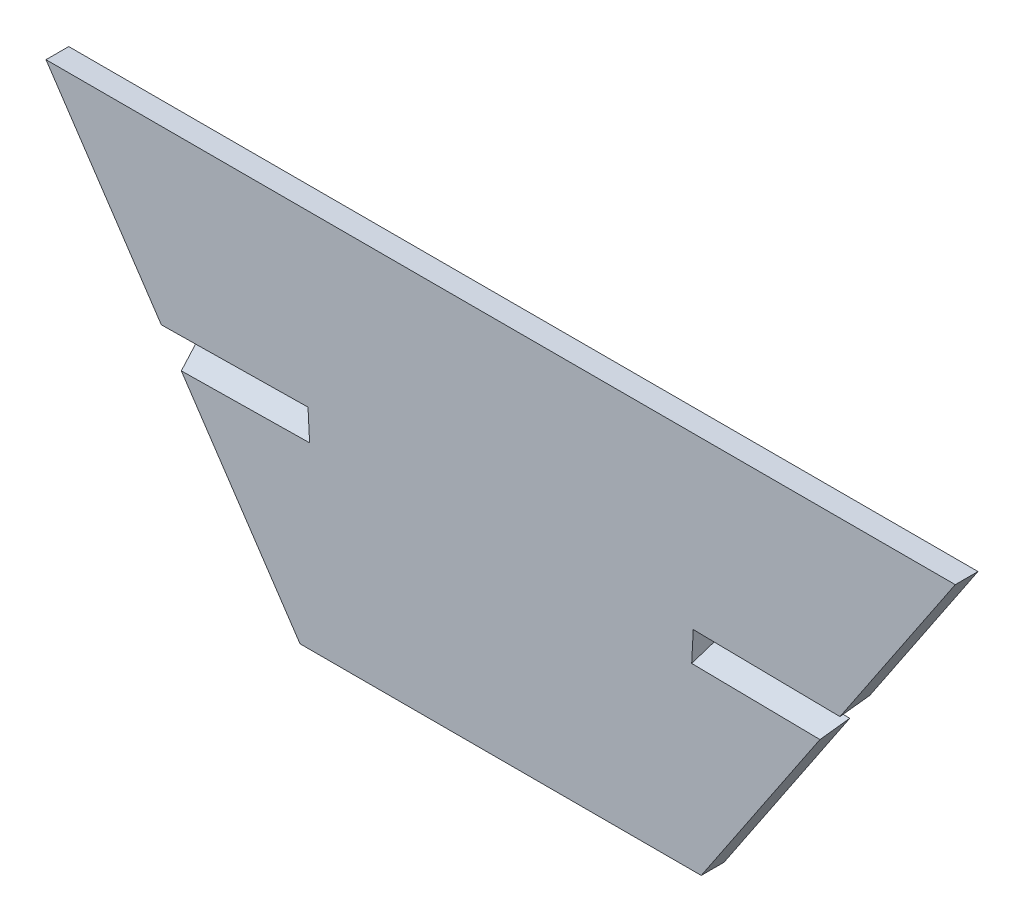
ISO-10303-21;
HEADER;
FILE_DESCRIPTION(('STEP AP214'),'2;1');
FILE_NAME('part.step','',(''),(''),'','','');
FILE_SCHEMA(('AUTOMOTIVE_DESIGN { 1 0 10303 214 1 1 1 1 }'));
ENDSEC;
DATA;
#1=APPLICATION_CONTEXT('core data for automotive mechanical design processes');
#2=APPLICATION_PROTOCOL_DEFINITION('international standard','automotive_design',2000,#1);
#3=PRODUCT_CONTEXT('',#1,'mechanical');
#4=PRODUCT('Part','Part','',(#3));
#5=PRODUCT_RELATED_PRODUCT_CATEGORY('part','',(#4));
#6=PRODUCT_DEFINITION_FORMATION('','',#4);
#7=PRODUCT_DEFINITION_CONTEXT('part definition',#1,'design');
#8=PRODUCT_DEFINITION('design','',#6,#7);
#9=PRODUCT_DEFINITION_SHAPE('','',#8);
#10=(LENGTH_UNIT() NAMED_UNIT(*) SI_UNIT(.MILLI.,.METRE.));
#11=(NAMED_UNIT(*) PLANE_ANGLE_UNIT() SI_UNIT($,.RADIAN.));
#12=(NAMED_UNIT(*) SI_UNIT($,.STERADIAN.) SOLID_ANGLE_UNIT());
#13=UNCERTAINTY_MEASURE_WITH_UNIT(LENGTH_MEASURE(1.E-05),#10,'distance_accuracy_value','');
#14=(GEOMETRIC_REPRESENTATION_CONTEXT(3) GLOBAL_UNCERTAINTY_ASSIGNED_CONTEXT((#13)) GLOBAL_UNIT_ASSIGNED_CONTEXT((#10,
#11,#12)) REPRESENTATION_CONTEXT('',''));
#15=CARTESIAN_POINT('',(0.,0.,0.));
#16=DIRECTION('',(0.,0.,1.));
#17=DIRECTION('',(1.,0.,0.));
#18=AXIS2_PLACEMENT_3D('',#15,#16,#17);
#19=CARTESIAN_POINT('',(-26.4736646084838,-15.,-3.));
#20=DIRECTION('',(0.830567629960138,0.556917778547606,0.));
#21=DIRECTION('',(-0.556917778547606,0.830567629960138,0.));
#22=AXIS2_PLACEMENT_3D('',#19,#20,#21);
#23=PLANE('',#22);
#24=DIRECTION('',(-0.272099817388273,0.40580011834089,-0.872518167909292));
#25=VECTOR('',#24,1.);
#26=CARTESIAN_POINT('',(-41.1245797226406,6.84986062906272,11.7311400826613));
#27=LINE('',#26,#25);
#28=CARTESIAN_POINT('',(-44.7830033425144,12.3059052237839,0.));
#29=VERTEX_POINT('',#28);
#30=CARTESIAN_POINT('',(-45.7185706260253,13.7011774367852,-3.));
#31=VERTEX_POINT('',#30);
#32=EDGE_CURVE('E118',#29,#31,#27,.T.);
#33=ORIENTED_EDGE('',*,*,#32,.F.);
#34=DIRECTION('',(-0.556917778547606,0.830567629960138,0.));
#35=VECTOR('',#34,1.);
#36=CARTESIAN_POINT('',(-26.4736646084838,-15.,0.));
#37=LINE('',#36,#35);
#38=CARTESIAN_POINT('',(-60.,35.,0.));
#39=VERTEX_POINT('',#38);
#40=EDGE_CURVE('E208',#29,#39,#37,.T.);
#41=ORIENTED_EDGE('',*,*,#40,.T.);
#42=DIRECTION('',(0.,0.,1.));
#43=VECTOR('',#42,1.);
#44=CARTESIAN_POINT('',(-60.,35.,-3.));
#45=LINE('',#44,#43);
#46=CARTESIAN_POINT('',(-60.,35.,-3.));
#47=VERTEX_POINT('',#46);
#48=EDGE_CURVE('E188',#47,#39,#45,.T.);
#49=ORIENTED_EDGE('',*,*,#48,.F.);
#50=DIRECTION('',(-0.556917778547606,0.830567629960138,0.));
#51=VECTOR('',#50,1.);
#52=CARTESIAN_POINT('',(-43.9559250314454,11.0724296568743,-3.));
#53=LINE('',#52,#51);
#54=EDGE_CURVE('E223',#31,#47,#53,.T.);
#55=ORIENTED_EDGE('',*,*,#54,.F.);
#56=EDGE_LOOP('',(#33,#41,#49,#55));
#57=FACE_BOUND('',#56,.T.);
#58=ADVANCED_FACE('F46',(#57),#23,.F.);
#59=CARTESIAN_POINT('',(43.9559250314454,11.0724296568742,-3.));
#60=DIRECTION('',(0.830567629960138,-0.556917778547606,0.));
#61=DIRECTION('',(0.556917778547606,0.830567629960138,0.));
#62=AXIS2_PLACEMENT_3D('',#59,#60,#61);
#63=PLANE('',#62);
#64=DIRECTION('',(0.556917778547606,0.830567629960138,0.));
#65=VECTOR('',#64,1.);
#66=CARTESIAN_POINT('',(43.9559250314454,11.0724296568742,0.));
#67=LINE('',#66,#65);
#68=CARTESIAN_POINT('',(44.7830033425188,12.3059052237904,0.));
#69=VERTEX_POINT('',#68);
#70=CARTESIAN_POINT('',(60.,35.,0.));
#71=VERTEX_POINT('',#70);
#72=EDGE_CURVE('E174',#69,#71,#67,.T.);
#73=ORIENTED_EDGE('',*,*,#72,.F.);
#74=DIRECTION('',(0.272099817388271,0.405800118340887,-0.872518167909294));
#75=VECTOR('',#74,1.);
#76=CARTESIAN_POINT('',(45.2978058885958,13.0736636740731,-1.65077131858995));
#77=LINE('',#76,#75);
#78=CARTESIAN_POINT('',(45.7185706260298,13.7011774367918,-3.));
#79=VERTEX_POINT('',#78);
#80=EDGE_CURVE('E133',#69,#79,#77,.T.);
#81=ORIENTED_EDGE('',*,*,#80,.T.);
#82=DIRECTION('',(0.556917778547606,0.830567629960137,0.));
#83=VECTOR('',#82,1.);
#84=CARTESIAN_POINT('',(26.4736646084838,-15.,-3.));
#85=LINE('',#84,#83);
#86=CARTESIAN_POINT('',(60.,35.,-3.));
#87=VERTEX_POINT('',#86);
#88=EDGE_CURVE('E130',#79,#87,#85,.T.);
#89=ORIENTED_EDGE('',*,*,#88,.T.);
#90=DIRECTION('',(0.,0.,1.));
#91=VECTOR('',#90,1.);
#92=CARTESIAN_POINT('',(60.,35.,-3.));
#93=LINE('',#92,#91);
#94=EDGE_CURVE('E184',#87,#71,#93,.T.);
#95=ORIENTED_EDGE('',*,*,#94,.T.);
#96=EDGE_LOOP('',(#73,#81,#89,#95));
#97=FACE_BOUND('',#96,.T.);
#98=ADVANCED_FACE('F238',(#97),#63,.T.);
#99=CARTESIAN_POINT('',(-26.4736646084838,-15.,-3.));
#100=DIRECTION('',(0.,-1.,0.));
#101=DIRECTION('',(1.,0.,0.));
#102=AXIS2_PLACEMENT_3D('',#99,#100,#101);
#103=PLANE('',#102);
#104=DIRECTION('',(1.,0.,0.));
#105=VECTOR('',#104,1.);
#106=CARTESIAN_POINT('',(-26.4736646084838,-15.,0.));
#107=LINE('',#106,#105);
#108=CARTESIAN_POINT('',(-26.4736646084838,-15.,0.));
#109=VERTEX_POINT('',#108);
#110=CARTESIAN_POINT('',(26.4736646084838,-15.,0.));
#111=VERTEX_POINT('',#110);
#112=EDGE_CURVE('E200',#109,#111,#107,.T.);
#113=ORIENTED_EDGE('',*,*,#112,.F.);
#114=DIRECTION('',(0.,0.,1.));
#115=VECTOR('',#114,1.);
#116=CARTESIAN_POINT('',(-26.4736646084838,-15.,-3.));
#117=LINE('',#116,#115);
#118=CARTESIAN_POINT('',(-26.4736646084838,-15.,-3.));
#119=VERTEX_POINT('',#118);
#120=EDGE_CURVE('E193',#119,#109,#117,.T.);
#121=ORIENTED_EDGE('',*,*,#120,.F.);
#122=DIRECTION('',(1.,0.,0.));
#123=VECTOR('',#122,1.);
#124=CARTESIAN_POINT('',(-26.4736646084838,-15.,-3.));
#125=LINE('',#124,#123);
#126=CARTESIAN_POINT('',(26.4736646084838,-15.,-3.));
#127=VERTEX_POINT('',#126);
#128=EDGE_CURVE('E189',#119,#127,#125,.T.);
#129=ORIENTED_EDGE('',*,*,#128,.T.);
#130=DIRECTION('',(0.,0.,1.));
#131=VECTOR('',#130,1.);
#132=CARTESIAN_POINT('',(26.4736646084838,-15.,-3.));
#133=LINE('',#132,#131);
#134=EDGE_CURVE('E147',#127,#111,#133,.T.);
#135=ORIENTED_EDGE('',*,*,#134,.T.);
#136=EDGE_LOOP('',(#113,#121,#129,#135));
#137=FACE_BOUND('',#136,.T.);
#138=ADVANCED_FACE('F292',(#137),#103,.T.);
#139=CARTESIAN_POINT('',(-42.1409374729324,8.36562090888881,0.));
#140=VERTEX_POINT('',#139);
#141=EDGE_CURVE('E204',#109,#140,#37,.T.);
#142=ORIENTED_EDGE('',*,*,#141,.T.);
#143=DIRECTION('',(-0.272099817388273,0.40580011834089,-0.872518167909292));
#144=VECTOR('',#143,1.);
#145=CARTESIAN_POINT('',(-39.1132068042187,3.85016964743089,9.70875335876896));
#146=LINE('',#145,#144);
#147=CARTESIAN_POINT('',(-43.0765047564433,9.76089312189015,-3.));
#148=VERTEX_POINT('',#147);
#149=EDGE_CURVE('E169',#140,#148,#146,.T.);
#150=ORIENTED_EDGE('',*,*,#149,.T.);
#151=EDGE_CURVE('E220',#119,#148,#53,.T.);
#152=ORIENTED_EDGE('',*,*,#151,.F.);
#153=ORIENTED_EDGE('',*,*,#120,.T.);
#154=EDGE_LOOP('',(#142,#150,#152,#153));
#155=FACE_BOUND('',#154,.T.);
#156=ADVANCED_FACE('F289',(#155),#23,.F.);
#157=CARTESIAN_POINT('',(60.,35.,-3.));
#158=DIRECTION('',(0.,1.,0.));
#159=DIRECTION('',(-1.,0.,0.));
#160=AXIS2_PLACEMENT_3D('',#157,#158,#159);
#161=PLANE('',#160);
#162=DIRECTION('',(-1.,0.,0.));
#163=VECTOR('',#162,1.);
#164=CARTESIAN_POINT('',(60.,35.,0.));
#165=LINE('',#164,#163);
#166=EDGE_CURVE('E209',#71,#39,#165,.T.);
#167=ORIENTED_EDGE('',*,*,#166,.F.);
#168=ORIENTED_EDGE('',*,*,#94,.F.);
#169=DIRECTION('',(-1.,0.,0.));
#170=VECTOR('',#169,1.);
#171=CARTESIAN_POINT('',(60.,35.,-3.));
#172=LINE('',#171,#170);
#173=EDGE_CURVE('E224',#87,#47,#172,.T.);
#174=ORIENTED_EDGE('',*,*,#173,.T.);
#175=ORIENTED_EDGE('',*,*,#48,.T.);
#176=EDGE_LOOP('',(#167,#168,#174,#175));
#177=FACE_BOUND('',#176,.T.);
#178=ADVANCED_FACE('F245',(#177),#161,.T.);
#179=DIRECTION('',(0.272099817388271,0.405800118340887,-0.872518167909294));
#180=VECTOR('',#179,1.);
#181=CARTESIAN_POINT('',(43.2864329701739,10.0739726924414,-3.67315804248224));
#182=LINE('',#181,#180);
#183=CARTESIAN_POINT('',(42.1409374729368,8.36562090889542,0.));
#184=VERTEX_POINT('',#183);
#185=CARTESIAN_POINT('',(43.0765047564477,9.76089312189675,-3.));
#186=VERTEX_POINT('',#185);
#187=EDGE_CURVE('E132',#184,#186,#182,.T.);
#188=ORIENTED_EDGE('',*,*,#187,.F.);
#189=EDGE_CURVE('E213',#111,#184,#67,.T.);
#190=ORIENTED_EDGE('',*,*,#189,.F.);
#191=ORIENTED_EDGE('',*,*,#134,.F.);
#192=EDGE_CURVE('E228',#127,#186,#85,.T.);
#193=ORIENTED_EDGE('',*,*,#192,.T.);
#194=EDGE_LOOP('',(#188,#190,#191,#193));
#195=FACE_BOUND('',#194,.T.);
#196=ADVANCED_FACE('F294',(#195),#63,.T.);
#197=CARTESIAN_POINT('',(0.,0.,-3.));
#198=DIRECTION('',(0.,0.,1.));
#199=DIRECTION('',(1.,0.,0.));
#200=AXIS2_PLACEMENT_3D('',#197,#198,#199);
#201=PLANE('',#200);
#202=ORIENTED_EDGE('',*,*,#151,.T.);
#203=DIRECTION('',(0.999901942074402,0.0140037936231734,0.));
#204=VECTOR('',#203,1.);
#205=CARTESIAN_POINT('',(-0.145123700565708,10.3621542805764,-3.));
#206=LINE('',#205,#204);
#207=CARTESIAN_POINT('',(-25.5327186801853,10.0065967746617,-3.));
#208=VERTEX_POINT('',#207);
#209=EDGE_CURVE('E175',#148,#208,#206,.T.);
#210=ORIENTED_EDGE('',*,*,#209,.T.);
#211=DIRECTION('',(-0.0525118926186274,0.998620298779075,0.));
#212=VECTOR('',#211,1.);
#213=CARTESIAN_POINT('',(-24.9375718872245,-1.31132833842079,-3.));
#214=LINE('',#213,#212);
#215=CARTESIAN_POINT('',(-25.7417081864755,13.9809567302043,-3.));
#216=VERTEX_POINT('',#215);
#217=EDGE_CURVE('E170',#208,#216,#214,.T.);
#218=ORIENTED_EDGE('',*,*,#217,.T.);
#219=DIRECTION('',(0.999901942074402,0.0140037936231734,0.));
#220=VECTOR('',#219,1.);
#221=CARTESIAN_POINT('',(-0.200815343789401,14.338661198283,-3.));
#222=LINE('',#221,#220);
#223=EDGE_CURVE('E166',#31,#216,#222,.T.);
#224=ORIENTED_EDGE('',*,*,#223,.F.);
#225=ORIENTED_EDGE('',*,*,#54,.T.);
#226=ORIENTED_EDGE('',*,*,#173,.F.);
#227=ORIENTED_EDGE('',*,*,#88,.F.);
#228=DIRECTION('',(0.999901942074401,-0.0140037936231978,0.));
#229=VECTOR('',#228,1.);
#230=CARTESIAN_POINT('',(0.200815343789859,14.3386611982907,-3.));
#231=LINE('',#230,#229);
#232=CARTESIAN_POINT('',(25.7417081864528,13.9809567302118,-3.));
#233=VERTEX_POINT('',#232);
#234=EDGE_CURVE('E50',#233,#79,#231,.T.);
#235=ORIENTED_EDGE('',*,*,#234,.F.);
#236=DIRECTION('',(0.0525118926186415,0.998620298779075,0.));
#237=VECTOR('',#236,1.);
#238=CARTESIAN_POINT('',(24.9375718872013,-1.31132833841992,-3.));
#239=LINE('',#238,#237);
#240=CARTESIAN_POINT('',(25.5327186801625,10.0065967746691,-3.));
#241=VERTEX_POINT('',#240);
#242=EDGE_CURVE('E109',#241,#233,#239,.T.);
#243=ORIENTED_EDGE('',*,*,#242,.F.);
#244=DIRECTION('',(0.999901942074401,-0.0140037936231978,0.));
#245=VECTOR('',#244,1.);
#246=CARTESIAN_POINT('',(0.145123700566069,10.3621542805841,-3.));
#247=LINE('',#246,#245);
#248=EDGE_CURVE('E119',#241,#186,#247,.T.);
#249=ORIENTED_EDGE('',*,*,#248,.T.);
#250=ORIENTED_EDGE('',*,*,#192,.F.);
#251=ORIENTED_EDGE('',*,*,#128,.F.);
#252=EDGE_LOOP('',(#202,#210,#218,#224,#225,#226,#227,#235,#243,#249,#250,#251));
#253=FACE_BOUND('',#252,.T.);
#254=ADVANCED_FACE('F127',(#253),#201,.F.);
#255=CARTESIAN_POINT('',(0.,0.,0.));
#256=DIRECTION('',(0.,0.,1.));
#257=DIRECTION('',(1.,0.,0.));
#258=AXIS2_PLACEMENT_3D('',#255,#256,#257);
#259=PLANE('',#258);
#260=DIRECTION('',(0.999901942074402,0.0140037936231734,0.));
#261=VECTOR('',#260,1.);
#262=CARTESIAN_POINT('',(-0.125403041832362,8.95405548270293,0.));
#263=LINE('',#262,#261);
#264=CARTESIAN_POINT('',(-25.2123611637799,8.60270844616842,0.));
#265=VERTEX_POINT('',#264);
#266=EDGE_CURVE('E12',#140,#265,#263,.T.);
#267=ORIENTED_EDGE('',*,*,#266,.F.);
#268=ORIENTED_EDGE('',*,*,#141,.F.);
#269=ORIENTED_EDGE('',*,*,#112,.T.);
#270=ORIENTED_EDGE('',*,*,#189,.T.);
#271=DIRECTION('',(0.999901942074401,-0.0140037936231978,0.));
#272=VECTOR('',#271,1.);
#273=CARTESIAN_POINT('',(0.125403041832689,8.95405548271063,0.));
#274=LINE('',#273,#272);
#275=CARTESIAN_POINT('',(25.2123611637571,8.60270844617582,0.));
#276=VERTEX_POINT('',#275);
#277=EDGE_CURVE('E150',#276,#184,#274,.T.);
#278=ORIENTED_EDGE('',*,*,#277,.F.);
#279=DIRECTION('',(0.0525118926186415,0.998620298779075,0.));
#280=VECTOR('',#279,1.);
#281=CARTESIAN_POINT('',(24.6917168767151,-1.2984001895267,0.));
#282=LINE('',#281,#280);
#283=CARTESIAN_POINT('',(25.4213506700474,12.5770684017185,0.));
#284=VERTEX_POINT('',#283);
#285=EDGE_CURVE('E146',#276,#284,#282,.T.);
#286=ORIENTED_EDGE('',*,*,#285,.T.);
#287=DIRECTION('',(0.999901942074401,-0.0140037936231978,0.));
#288=VECTOR('',#287,1.);
#289=CARTESIAN_POINT('',(0.181094685056478,12.9305624004172,0.));
#290=LINE('',#289,#288);
#291=EDGE_CURVE('E122',#284,#69,#290,.T.);
#292=ORIENTED_EDGE('',*,*,#291,.T.);
#293=ORIENTED_EDGE('',*,*,#72,.T.);
#294=ORIENTED_EDGE('',*,*,#166,.T.);
#295=ORIENTED_EDGE('',*,*,#40,.F.);
#296=DIRECTION('',(0.999901942074402,0.0140037936231734,0.));
#297=VECTOR('',#296,1.);
#298=CARTESIAN_POINT('',(-0.181094685056055,12.9305624004095,0.));
#299=LINE('',#298,#297);
#300=CARTESIAN_POINT('',(-25.4213506700701,12.5770684017111,0.));
#301=VERTEX_POINT('',#300);
#302=EDGE_CURVE('E152',#29,#301,#299,.T.);
#303=ORIENTED_EDGE('',*,*,#302,.T.);
#304=DIRECTION('',(-0.0525118926186274,0.998620298779075,0.));
#305=VECTOR('',#304,1.);
#306=CARTESIAN_POINT('',(-24.6917168767383,-1.29840018952757,0.));
#307=LINE('',#306,#305);
#308=EDGE_CURVE('E57',#265,#301,#307,.T.);
#309=ORIENTED_EDGE('',*,*,#308,.F.);
#310=EDGE_LOOP('',(#267,#268,#269,#270,#278,#286,#292,#293,#294,#295,#303,#309));
#311=FACE_BOUND('',#310,.T.);
#312=ADVANCED_FACE('F263',(#311),#259,.T.);
#313=CARTESIAN_POINT('',(25.320487563662,9.33142212346961,-0.849462894442357));
#314=DIRECTION('',(0.995274511238513,-0.0523359562429545,0.0817899441439711));
#315=DIRECTION('',(0.0126766316840594,0.905139634367045,0.424925340862413));
#316=AXIS2_PLACEMENT_3D('',#313,#314,#315);
#317=PLANE('',#316);
#318=ORIENTED_EDGE('',*,*,#242,.T.);
#319=DIRECTION('',(0.0962701941832729,0.421880539942324,-0.901525850838393));
#320=VECTOR('',#319,1.);
#321=CARTESIAN_POINT('',(25.3623204482194,12.3183829168809,0.55279073040361));
#322=LINE('',#321,#320);
#323=EDGE_CURVE('E111',#284,#233,#322,.T.);
#324=ORIENTED_EDGE('',*,*,#323,.F.);
#325=ORIENTED_EDGE('',*,*,#285,.F.);
#326=DIRECTION('',(0.0962701941832729,0.421880539942324,-0.901525850838393));
#327=VECTOR('',#326,1.);
#328=CARTESIAN_POINT('',(25.3166845741568,9.0598802331595,-0.976940496701077));
#329=LINE('',#328,#327);
#330=EDGE_CURVE('E114',#276,#241,#329,.T.);
#331=ORIENTED_EDGE('',*,*,#330,.T.);
#332=EDGE_LOOP('',(#318,#324,#325,#331));
#333=FACE_BOUND('',#332,.T.);
#334=ADVANCED_FACE('F110',(#333),#317,.T.);
#335=CARTESIAN_POINT('',(324.197620299082,-6.65660742659972,23.5845797297334));
#336=DIRECTION('',(-0.0126766316840594,-0.905139634367045,-0.424925340862413));
#337=DIRECTION('',(0.995274511238513,-0.0523359562429545,0.0817899441439711));
#338=AXIS2_PLACEMENT_3D('',#335,#336,#337);
#339=PLANE('',#338);
#340=ORIENTED_EDGE('',*,*,#330,.F.);
#341=ORIENTED_EDGE('',*,*,#277,.T.);
#342=ORIENTED_EDGE('',*,*,#187,.T.);
#343=ORIENTED_EDGE('',*,*,#248,.F.);
#344=EDGE_LOOP('',(#340,#341,#342,#343));
#345=FACE_BOUND('',#344,.T.);
#346=ADVANCED_FACE('F296',(#345),#339,.F.);
#347=CARTESIAN_POINT('',(324.243256173145,-3.39810474287836,25.1143109568381));
#348=DIRECTION('',(-0.0126766316840594,-0.905139634367045,-0.424925340862413));
#349=DIRECTION('',(0.995274511238513,-0.0523359562429545,0.0817899441439711));
#350=AXIS2_PLACEMENT_3D('',#347,#348,#349);
#351=PLANE('',#350);
#352=ORIENTED_EDGE('',*,*,#234,.T.);
#353=ORIENTED_EDGE('',*,*,#80,.F.);
#354=ORIENTED_EDGE('',*,*,#291,.F.);
#355=ORIENTED_EDGE('',*,*,#323,.T.);
#356=EDGE_LOOP('',(#352,#353,#354,#355));
#357=FACE_BOUND('',#356,.T.);
#358=ADVANCED_FACE('F48',(#357),#351,.T.);
#359=CARTESIAN_POINT('',(-25.3204875636853,9.33142212346447,-0.849462894447175));
#360=DIRECTION('',(0.995274511238512,0.0523359562429403,-0.0817899441439931));
#361=DIRECTION('',(-0.0126766316840373,0.905139634367047,0.424925340862411));
#362=AXIS2_PLACEMENT_3D('',#359,#360,#361);
#363=PLANE('',#362);
#364=DIRECTION('',(-0.0962701941832867,0.421880539942323,-0.901525850838392));
#365=VECTOR('',#364,1.);
#366=CARTESIAN_POINT('',(-25.3166845741801,9.05988023315435,-0.9769404967059));
#367=LINE('',#366,#365);
#368=EDGE_CURVE('E137',#265,#208,#367,.T.);
#369=ORIENTED_EDGE('',*,*,#368,.F.);
#370=ORIENTED_EDGE('',*,*,#308,.T.);
#371=DIRECTION('',(-0.0962701941832867,0.421880539942323,-0.901525850838392));
#372=VECTOR('',#371,1.);
#373=CARTESIAN_POINT('',(-25.3623204482426,12.3183829168757,0.552790730398779));
#374=LINE('',#373,#372);
#375=EDGE_CURVE('E66',#301,#216,#374,.T.);
#376=ORIENTED_EDGE('',*,*,#375,.T.);
#377=ORIENTED_EDGE('',*,*,#217,.F.);
#378=EDGE_LOOP('',(#369,#370,#376,#377));
#379=FACE_BOUND('',#378,.T.);
#380=ADVANCED_FACE('F282',(#379),#363,.F.);
#381=CARTESIAN_POINT('',(-324.197620299105,-6.65660742660061,23.5845797297352));
#382=DIRECTION('',(0.0126766316840373,-0.905139634367047,-0.424925340862411));
#383=DIRECTION('',(0.995274511238512,0.0523359562429403,-0.0817899441439931));
#384=AXIS2_PLACEMENT_3D('',#381,#382,#383);
#385=PLANE('',#384);
#386=ORIENTED_EDGE('',*,*,#149,.F.);
#387=ORIENTED_EDGE('',*,*,#266,.T.);
#388=ORIENTED_EDGE('',*,*,#368,.T.);
#389=ORIENTED_EDGE('',*,*,#209,.F.);
#390=EDGE_LOOP('',(#386,#387,#388,#389));
#391=FACE_BOUND('',#390,.T.);
#392=ADVANCED_FACE('F284',(#391),#385,.F.);
#393=CARTESIAN_POINT('',(-324.243256173168,-3.39810474287925,25.1143109568399));
#394=DIRECTION('',(0.0126766316840373,-0.905139634367047,-0.424925340862411));
#395=DIRECTION('',(0.995274511238512,0.0523359562429403,-0.0817899441439931));
#396=AXIS2_PLACEMENT_3D('',#393,#394,#395);
#397=PLANE('',#396);
#398=ORIENTED_EDGE('',*,*,#223,.T.);
#399=ORIENTED_EDGE('',*,*,#375,.F.);
#400=ORIENTED_EDGE('',*,*,#302,.F.);
#401=ORIENTED_EDGE('',*,*,#32,.T.);
#402=EDGE_LOOP('',(#398,#399,#400,#401));
#403=FACE_BOUND('',#402,.T.);
#404=ADVANCED_FACE('F277',(#403),#397,.T.);
#405=CLOSED_SHELL('',(#58,#98,#138,#156,#178,#196,#254,#312,#334,#346,#358,#380,#392,#404));
#406=MANIFOLD_SOLID_BREP('B2',#405);
#407=ADVANCED_BREP_SHAPE_REPRESENTATION('',(#18,#406),#14);
#408=SHAPE_DEFINITION_REPRESENTATION(#9,#407);
ENDSEC;
END-ISO-10303-21;
